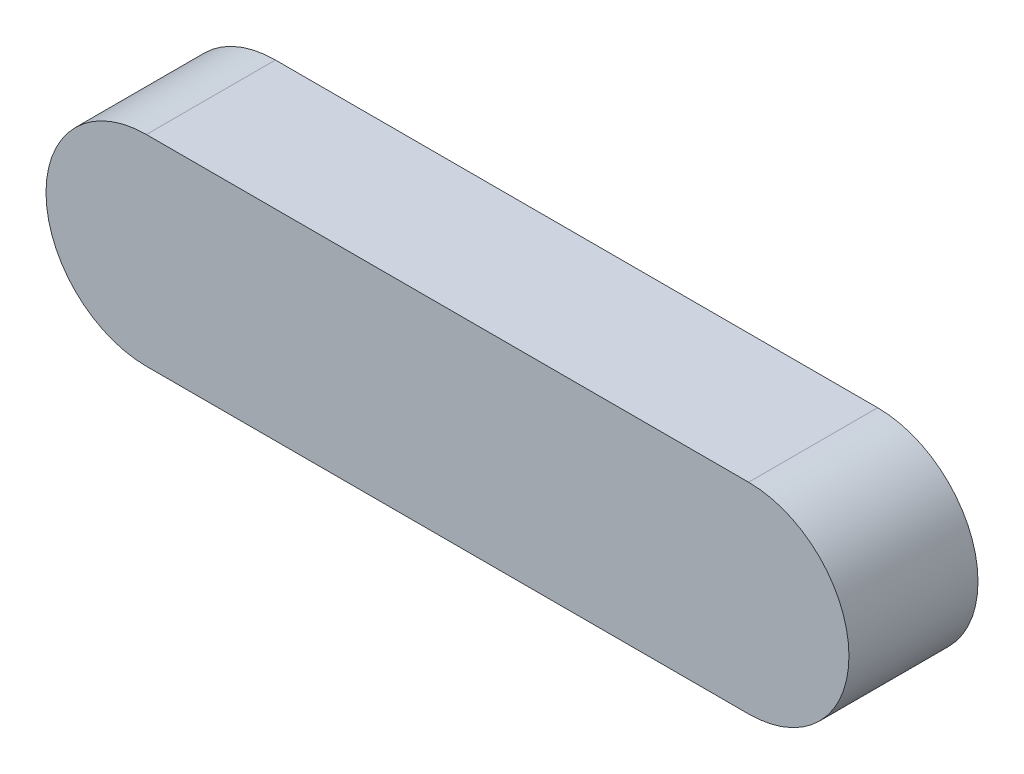
ISO-10303-21;
HEADER;
FILE_DESCRIPTION(('STEP AP214'),'2;1');
FILE_NAME('part.step','',(''),(''),'','','');
FILE_SCHEMA(('AUTOMOTIVE_DESIGN { 1 0 10303 214 1 1 1 1 }'));
ENDSEC;
DATA;
#1=APPLICATION_CONTEXT('core data for automotive mechanical design processes');
#2=APPLICATION_PROTOCOL_DEFINITION('international standard','automotive_design',2000,#1);
#3=PRODUCT_CONTEXT('',#1,'mechanical');
#4=PRODUCT('Part','Part','',(#3));
#5=PRODUCT_RELATED_PRODUCT_CATEGORY('part','',(#4));
#6=PRODUCT_DEFINITION_FORMATION('','',#4);
#7=PRODUCT_DEFINITION_CONTEXT('part definition',#1,'design');
#8=PRODUCT_DEFINITION('design','',#6,#7);
#9=PRODUCT_DEFINITION_SHAPE('','',#8);
#10=(LENGTH_UNIT() NAMED_UNIT(*) SI_UNIT(.MILLI.,.METRE.));
#11=(NAMED_UNIT(*) PLANE_ANGLE_UNIT() SI_UNIT($,.RADIAN.));
#12=(NAMED_UNIT(*) SI_UNIT($,.STERADIAN.) SOLID_ANGLE_UNIT());
#13=UNCERTAINTY_MEASURE_WITH_UNIT(LENGTH_MEASURE(1.E-05),#10,'distance_accuracy_value','');
#14=(GEOMETRIC_REPRESENTATION_CONTEXT(3) GLOBAL_UNCERTAINTY_ASSIGNED_CONTEXT((#13)) GLOBAL_UNIT_ASSIGNED_CONTEXT((#10,
#11,#12)) REPRESENTATION_CONTEXT('',''));
#15=CARTESIAN_POINT('',(0.,0.,0.));
#16=DIRECTION('',(0.,0.,1.));
#17=DIRECTION('',(1.,0.,0.));
#18=AXIS2_PLACEMENT_3D('',#15,#16,#17);
#19=CARTESIAN_POINT('',(-21.0000000000001,0.,9.00000000000079));
#20=DIRECTION('',(0.,0.,-1.));
#21=DIRECTION('',(-1.,0.,0.));
#22=AXIS2_PLACEMENT_3D('',#19,#20,#21);
#23=CYLINDRICAL_SURFACE('',#22,7.);
#24=CARTESIAN_POINT('',(-21.0000000000012,2.77555756156289E-13,1.27675647831893E-12));
#25=DIRECTION('',(0.,0.,1.));
#26=DIRECTION('',(1.,0.,0.));
#27=AXIS2_PLACEMENT_3D('',#24,#25,#26);
#28=CIRCLE('',#27,7.);
#29=CARTESIAN_POINT('',(-21.0000000000006,7.00000000000062,-8.88178419700125E-13));
#30=VERTEX_POINT('',#29);
#31=CARTESIAN_POINT('',(-21.0000000000008,-7.00000000000084,-2.66453525910038E-12));
#32=VERTEX_POINT('',#31);
#33=EDGE_CURVE('E93',#30,#32,#28,.T.);
#34=ORIENTED_EDGE('',*,*,#33,.T.);
#35=DIRECTION('',(0.,0.,-1.));
#36=VECTOR('',#35,1.);
#37=CARTESIAN_POINT('',(-21.0000000000001,-7.00000000000053,9.00000000000079));
#38=LINE('',#37,#36);
#39=CARTESIAN_POINT('',(-21.0000000000001,-7.00000000000053,9.00000000000079));
#40=VERTEX_POINT('',#39);
#41=EDGE_CURVE('E11',#40,#32,#38,.T.);
#42=ORIENTED_EDGE('',*,*,#41,.F.);
#43=CARTESIAN_POINT('',(-21.0000000000001,0.,9.00000000000079));
#44=DIRECTION('',(0.,0.,1.));
#45=DIRECTION('',(1.,0.,0.));
#46=AXIS2_PLACEMENT_3D('',#43,#44,#45);
#47=CIRCLE('',#46,7.);
#48=CARTESIAN_POINT('',(-21.0000000000001,6.99999999999956,8.99999999999906));
#49=VERTEX_POINT('',#48);
#50=EDGE_CURVE('E79',#49,#40,#47,.T.);
#51=ORIENTED_EDGE('',*,*,#50,.F.);
#52=DIRECTION('',(0.,0.,-1.));
#53=VECTOR('',#52,1.);
#54=CARTESIAN_POINT('',(-21.0000000000001,6.99999999999956,8.99999999999906));
#55=LINE('',#54,#53);
#56=EDGE_CURVE('E46',#49,#30,#55,.T.);
#57=ORIENTED_EDGE('',*,*,#56,.T.);
#58=EDGE_LOOP('',(#34,#42,#51,#57));
#59=FACE_BOUND('',#58,.T.);
#60=ADVANCED_FACE('F30',(#59),#23,.T.);
#61=CARTESIAN_POINT('',(-21.0000000000001,-7.00000000000053,9.00000000000079));
#62=DIRECTION('',(0.,1.,0.));
#63=DIRECTION('',(0.,0.,1.));
#64=AXIS2_PLACEMENT_3D('',#61,#62,#63);
#65=PLANE('',#64);
#66=DIRECTION('',(1.,0.,0.));
#67=VECTOR('',#66,1.);
#68=CARTESIAN_POINT('',(-21.0000000000008,-7.00000000000084,-2.66453525910038E-12));
#69=LINE('',#68,#67);
#70=CARTESIAN_POINT('',(20.9999999999986,-7.00000000000095,1.16573417585641E-12));
#71=VERTEX_POINT('',#70);
#72=EDGE_CURVE('E84',#32,#71,#69,.T.);
#73=ORIENTED_EDGE('',*,*,#72,.T.);
#74=DIRECTION('',(0.,0.,-1.));
#75=VECTOR('',#74,1.);
#76=CARTESIAN_POINT('',(20.9999999999995,-7.00000000000137,9.00000000000073));
#77=LINE('',#76,#75);
#78=CARTESIAN_POINT('',(20.9999999999995,-7.00000000000137,9.00000000000073));
#79=VERTEX_POINT('',#78);
#80=EDGE_CURVE('E38',#79,#71,#77,.T.);
#81=ORIENTED_EDGE('',*,*,#80,.F.);
#82=DIRECTION('',(1.,0.,0.));
#83=VECTOR('',#82,1.);
#84=CARTESIAN_POINT('',(-21.0000000000001,-7.00000000000053,9.00000000000079));
#85=LINE('',#84,#83);
#86=EDGE_CURVE('E72',#40,#79,#85,.T.);
#87=ORIENTED_EDGE('',*,*,#86,.F.);
#88=ORIENTED_EDGE('',*,*,#41,.T.);
#89=EDGE_LOOP('',(#73,#81,#87,#88));
#90=FACE_BOUND('',#89,.T.);
#91=ADVANCED_FACE('F83',(#90),#65,.F.);
#92=CARTESIAN_POINT('',(21.0000000000012,0.,9.00000000000045));
#93=DIRECTION('',(0.,0.,-1.));
#94=DIRECTION('',(-1.,0.,0.));
#95=AXIS2_PLACEMENT_3D('',#92,#93,#94);
#96=CYLINDRICAL_SURFACE('',#95,7.);
#97=CARTESIAN_POINT('',(20.9999999999999,-9.15933995315754E-13,-2.77555756156289E-13));
#98=DIRECTION('',(0.,0.,1.));
#99=DIRECTION('',(1.,0.,0.));
#100=AXIS2_PLACEMENT_3D('',#97,#98,#99);
#101=CIRCLE('',#100,7.);
#102=CARTESIAN_POINT('',(20.9999999999986,6.99999999999842,-1.11022302462516E-13));
#103=VERTEX_POINT('',#102);
#104=EDGE_CURVE('E96',#71,#103,#101,.T.);
#105=ORIENTED_EDGE('',*,*,#104,.T.);
#106=DIRECTION('',(0.,0.,-1.));
#107=VECTOR('',#106,1.);
#108=CARTESIAN_POINT('',(20.9999999999999,6.99999999999926,8.99999999999873));
#109=LINE('',#108,#107);
#110=CARTESIAN_POINT('',(20.9999999999999,6.99999999999926,8.99999999999873));
#111=VERTEX_POINT('',#110);
#112=EDGE_CURVE('E61',#111,#103,#109,.T.);
#113=ORIENTED_EDGE('',*,*,#112,.F.);
#114=CARTESIAN_POINT('',(21.0000000000012,0.,9.00000000000045));
#115=DIRECTION('',(0.,0.,1.));
#116=DIRECTION('',(1.,0.,0.));
#117=AXIS2_PLACEMENT_3D('',#114,#115,#116);
#118=CIRCLE('',#117,7.);
#119=EDGE_CURVE('E78',#79,#111,#118,.T.);
#120=ORIENTED_EDGE('',*,*,#119,.F.);
#121=ORIENTED_EDGE('',*,*,#80,.T.);
#122=EDGE_LOOP('',(#105,#113,#120,#121));
#123=FACE_BOUND('',#122,.T.);
#124=ADVANCED_FACE('F87',(#123),#96,.T.);
#125=CARTESIAN_POINT('',(-21.0000000000001,6.99999999999956,8.99999999999906));
#126=DIRECTION('',(0.,1.,0.));
#127=DIRECTION('',(0.,0.,1.));
#128=AXIS2_PLACEMENT_3D('',#125,#126,#127);
#129=PLANE('',#128);
#130=DIRECTION('',(1.,0.,0.));
#131=VECTOR('',#130,1.);
#132=CARTESIAN_POINT('',(-21.0000000000006,7.00000000000062,-8.88178419700125E-13));
#133=LINE('',#132,#131);
#134=EDGE_CURVE('E98',#30,#103,#133,.T.);
#135=ORIENTED_EDGE('',*,*,#134,.F.);
#136=ORIENTED_EDGE('',*,*,#56,.F.);
#137=DIRECTION('',(1.,0.,0.));
#138=VECTOR('',#137,1.);
#139=CARTESIAN_POINT('',(-21.0000000000001,6.99999999999956,8.99999999999906));
#140=LINE('',#139,#138);
#141=EDGE_CURVE('E88',#49,#111,#140,.T.);
#142=ORIENTED_EDGE('',*,*,#141,.T.);
#143=ORIENTED_EDGE('',*,*,#112,.T.);
#144=EDGE_LOOP('',(#135,#136,#142,#143));
#145=FACE_BOUND('',#144,.T.);
#146=ADVANCED_FACE('F104',(#145),#129,.T.);
#147=CARTESIAN_POINT('',(-21.0000000000001,0.,9.00000000000079));
#148=DIRECTION('',(0.,0.,1.));
#149=DIRECTION('',(1.,0.,0.));
#150=AXIS2_PLACEMENT_3D('',#147,#148,#149);
#151=PLANE('',#150);
#152=ORIENTED_EDGE('',*,*,#50,.T.);
#153=ORIENTED_EDGE('',*,*,#86,.T.);
#154=ORIENTED_EDGE('',*,*,#119,.T.);
#155=ORIENTED_EDGE('',*,*,#141,.F.);
#156=EDGE_LOOP('',(#152,#153,#154,#155));
#157=FACE_BOUND('',#156,.T.);
#158=ADVANCED_FACE('F75',(#157),#151,.T.);
#159=CARTESIAN_POINT('',(-21.0000000000012,2.77555756156289E-13,1.27675647831893E-12));
#160=DIRECTION('',(0.,0.,1.));
#161=DIRECTION('',(1.,0.,0.));
#162=AXIS2_PLACEMENT_3D('',#159,#160,#161);
#163=PLANE('',#162);
#164=ORIENTED_EDGE('',*,*,#33,.F.);
#165=ORIENTED_EDGE('',*,*,#134,.T.);
#166=ORIENTED_EDGE('',*,*,#104,.F.);
#167=ORIENTED_EDGE('',*,*,#72,.F.);
#168=EDGE_LOOP('',(#164,#165,#166,#167));
#169=FACE_BOUND('',#168,.T.);
#170=ADVANCED_FACE('F103',(#169),#163,.F.);
#171=CLOSED_SHELL('',(#60,#91,#124,#146,#158,#170));
#172=MANIFOLD_SOLID_BREP('B2',#171);
#173=ADVANCED_BREP_SHAPE_REPRESENTATION('',(#18,#172),#14);
#174=SHAPE_DEFINITION_REPRESENTATION(#9,#173);
ENDSEC;
END-ISO-10303-21;
